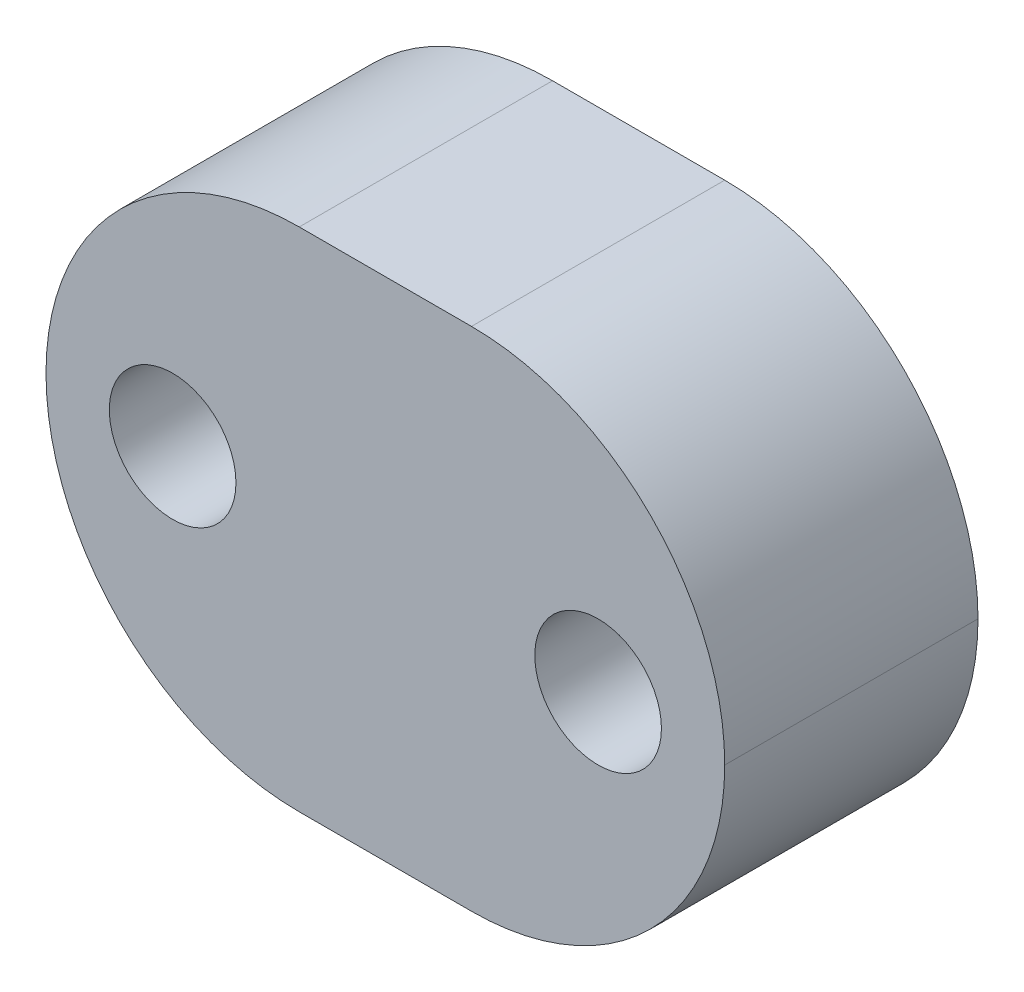
ISO-10303-21;
HEADER;
FILE_DESCRIPTION(('STEP AP214'),'2;1');
FILE_NAME('part.step','',(''),(''),'','','');
FILE_SCHEMA(('AUTOMOTIVE_DESIGN { 1 0 10303 214 1 1 1 1 }'));
ENDSEC;
DATA;
#1=APPLICATION_CONTEXT('core data for automotive mechanical design processes');
#2=APPLICATION_PROTOCOL_DEFINITION('international standard','automotive_design',2000,#1);
#3=PRODUCT_CONTEXT('',#1,'mechanical');
#4=PRODUCT('Part','Part','',(#3));
#5=PRODUCT_RELATED_PRODUCT_CATEGORY('part','',(#4));
#6=PRODUCT_DEFINITION_FORMATION('','',#4);
#7=PRODUCT_DEFINITION_CONTEXT('part definition',#1,'design');
#8=PRODUCT_DEFINITION('design','',#6,#7);
#9=PRODUCT_DEFINITION_SHAPE('','',#8);
#10=(LENGTH_UNIT() NAMED_UNIT(*) SI_UNIT(.MILLI.,.METRE.));
#11=(NAMED_UNIT(*) PLANE_ANGLE_UNIT() SI_UNIT($,.RADIAN.));
#12=(NAMED_UNIT(*) SI_UNIT($,.STERADIAN.) SOLID_ANGLE_UNIT());
#13=UNCERTAINTY_MEASURE_WITH_UNIT(LENGTH_MEASURE(1.E-05),#10,'distance_accuracy_value','');
#14=(GEOMETRIC_REPRESENTATION_CONTEXT(3) GLOBAL_UNCERTAINTY_ASSIGNED_CONTEXT((#13)) GLOBAL_UNIT_ASSIGNED_CONTEXT((#10,
#11,#12)) REPRESENTATION_CONTEXT('',''));
#15=CARTESIAN_POINT('',(0.,0.,0.));
#16=DIRECTION('',(0.,0.,1.));
#17=DIRECTION('',(1.,0.,0.));
#18=AXIS2_PLACEMENT_3D('',#15,#16,#17);
#19=CARTESIAN_POINT('',(0.,0.,10.));
#20=DIRECTION('',(0.,0.,1.));
#21=DIRECTION('',(1.,0.,0.));
#22=AXIS2_PLACEMENT_3D('',#19,#20,#21);
#23=PLANE('',#22);
#24=CARTESIAN_POINT('',(-8.4,0.,10.));
#25=DIRECTION('',(0.,0.,1.));
#26=DIRECTION('',(1.,0.,0.));
#27=AXIS2_PLACEMENT_3D('',#24,#25,#26);
#28=CIRCLE('',#27,2.5);
#29=CARTESIAN_POINT('',(-5.9,0.,10.));
#30=VERTEX_POINT('',#29);
#31=EDGE_CURVE('E136',#30,#30,#28,.T.);
#32=ORIENTED_EDGE('',*,*,#31,.F.);
#33=EDGE_LOOP('',(#32));
#34=FACE_BOUND('',#33,.T.);
#35=DIRECTION('',(1.,0.,0.));
#36=VECTOR('',#35,1.);
#37=CARTESIAN_POINT('',(-13.4,-10.,10.));
#38=LINE('',#37,#36);
#39=CARTESIAN_POINT('',(-3.4,-10.,10.));
#40=VERTEX_POINT('',#39);
#41=CARTESIAN_POINT('',(3.4,-10.,10.));
#42=VERTEX_POINT('',#41);
#43=EDGE_CURVE('E128',#40,#42,#38,.T.);
#44=ORIENTED_EDGE('',*,*,#43,.T.);
#45=CARTESIAN_POINT('',(3.4,0.,10.));
#46=DIRECTION('',(0.,0.,1.));
#47=DIRECTION('',(1.,0.,0.));
#48=AXIS2_PLACEMENT_3D('',#45,#46,#47);
#49=CIRCLE('',#48,10.);
#50=CARTESIAN_POINT('',(13.4,0.,10.));
#51=VERTEX_POINT('',#50);
#52=EDGE_CURVE('E123',#42,#51,#49,.T.);
#53=ORIENTED_EDGE('',*,*,#52,.T.);
#54=CARTESIAN_POINT('',(3.4,0.,10.));
#55=DIRECTION('',(0.,0.,1.));
#56=DIRECTION('',(1.,0.,0.));
#57=AXIS2_PLACEMENT_3D('',#54,#55,#56);
#58=CIRCLE('',#57,10.);
#59=CARTESIAN_POINT('',(3.4,10.,10.));
#60=VERTEX_POINT('',#59);
#61=EDGE_CURVE('E105',#51,#60,#58,.T.);
#62=ORIENTED_EDGE('',*,*,#61,.T.);
#63=DIRECTION('',(-1.,0.,0.));
#64=VECTOR('',#63,1.);
#65=CARTESIAN_POINT('',(-13.4,10.,10.));
#66=LINE('',#65,#64);
#67=CARTESIAN_POINT('',(-3.4,10.,10.));
#68=VERTEX_POINT('',#67);
#69=EDGE_CURVE('E133',#60,#68,#66,.T.);
#70=ORIENTED_EDGE('',*,*,#69,.T.);
#71=CARTESIAN_POINT('',(-3.4,0.,10.));
#72=DIRECTION('',(0.,0.,1.));
#73=DIRECTION('',(1.,0.,0.));
#74=AXIS2_PLACEMENT_3D('',#71,#72,#73);
#75=CIRCLE('',#74,10.);
#76=CARTESIAN_POINT('',(-13.4,0.,10.));
#77=VERTEX_POINT('',#76);
#78=EDGE_CURVE('E50',#68,#77,#75,.T.);
#79=ORIENTED_EDGE('',*,*,#78,.T.);
#80=CARTESIAN_POINT('',(-3.4,0.,10.));
#81=DIRECTION('',(0.,0.,1.));
#82=DIRECTION('',(1.,0.,0.));
#83=AXIS2_PLACEMENT_3D('',#80,#81,#82);
#84=CIRCLE('',#83,10.);
#85=EDGE_CURVE('E120',#77,#40,#84,.T.);
#86=ORIENTED_EDGE('',*,*,#85,.T.);
#87=EDGE_LOOP('',(#44,#53,#62,#70,#79,#86));
#88=FACE_BOUND('',#87,.T.);
#89=CARTESIAN_POINT('',(8.4,0.,10.));
#90=DIRECTION('',(0.,0.,1.));
#91=DIRECTION('',(1.,0.,0.));
#92=AXIS2_PLACEMENT_3D('',#89,#90,#91);
#93=CIRCLE('',#92,2.5);
#94=CARTESIAN_POINT('',(10.9,0.,10.));
#95=VERTEX_POINT('',#94);
#96=EDGE_CURVE('E184',#95,#95,#93,.T.);
#97=ORIENTED_EDGE('',*,*,#96,.F.);
#98=EDGE_LOOP('',(#97));
#99=FACE_BOUND('',#98,.T.);
#100=ADVANCED_FACE('F33',(#34,#88,#99),#23,.T.);
#101=CARTESIAN_POINT('',(0.,0.,0.));
#102=DIRECTION('',(0.,0.,1.));
#103=DIRECTION('',(1.,0.,0.));
#104=AXIS2_PLACEMENT_3D('',#101,#102,#103);
#105=PLANE('',#104);
#106=CARTESIAN_POINT('',(-8.4,0.,0.));
#107=DIRECTION('',(0.,0.,1.));
#108=DIRECTION('',(1.,0.,0.));
#109=AXIS2_PLACEMENT_3D('',#106,#107,#108);
#110=CIRCLE('',#109,2.5);
#111=CARTESIAN_POINT('',(-5.9,0.,0.));
#112=VERTEX_POINT('',#111);
#113=EDGE_CURVE('E188',#112,#112,#110,.T.);
#114=ORIENTED_EDGE('',*,*,#113,.T.);
#115=EDGE_LOOP('',(#114));
#116=FACE_BOUND('',#115,.T.);
#117=CARTESIAN_POINT('',(3.4,0.,0.));
#118=DIRECTION('',(0.,0.,1.));
#119=DIRECTION('',(1.,0.,0.));
#120=AXIS2_PLACEMENT_3D('',#117,#118,#119);
#121=CIRCLE('',#120,10.);
#122=CARTESIAN_POINT('',(3.4,10.,0.));
#123=VERTEX_POINT('',#122);
#124=CARTESIAN_POINT('',(13.4,0.,0.));
#125=VERTEX_POINT('',#124);
#126=EDGE_CURVE('E88',#123,#125,#121,.F.);
#127=ORIENTED_EDGE('',*,*,#126,.T.);
#128=CARTESIAN_POINT('',(3.4,0.,0.));
#129=DIRECTION('',(0.,0.,1.));
#130=DIRECTION('',(1.,0.,0.));
#131=AXIS2_PLACEMENT_3D('',#128,#129,#130);
#132=CIRCLE('',#131,10.);
#133=CARTESIAN_POINT('',(3.4,-10.,0.));
#134=VERTEX_POINT('',#133);
#135=EDGE_CURVE('E94',#125,#134,#132,.F.);
#136=ORIENTED_EDGE('',*,*,#135,.T.);
#137=DIRECTION('',(1.,0.,0.));
#138=VECTOR('',#137,1.);
#139=CARTESIAN_POINT('',(-13.4,-10.,0.));
#140=LINE('',#139,#138);
#141=CARTESIAN_POINT('',(-3.4,-10.,0.));
#142=VERTEX_POINT('',#141);
#143=EDGE_CURVE('E132',#142,#134,#140,.T.);
#144=ORIENTED_EDGE('',*,*,#143,.F.);
#145=CARTESIAN_POINT('',(-3.4,0.,0.));
#146=DIRECTION('',(0.,0.,1.));
#147=DIRECTION('',(1.,0.,0.));
#148=AXIS2_PLACEMENT_3D('',#145,#146,#147);
#149=CIRCLE('',#148,10.);
#150=CARTESIAN_POINT('',(-13.4,0.,0.));
#151=VERTEX_POINT('',#150);
#152=EDGE_CURVE('E99',#142,#151,#149,.F.);
#153=ORIENTED_EDGE('',*,*,#152,.T.);
#154=CARTESIAN_POINT('',(-3.4,0.,0.));
#155=DIRECTION('',(0.,0.,1.));
#156=DIRECTION('',(1.,0.,0.));
#157=AXIS2_PLACEMENT_3D('',#154,#155,#156);
#158=CIRCLE('',#157,10.);
#159=CARTESIAN_POINT('',(-3.4,10.,0.));
#160=VERTEX_POINT('',#159);
#161=EDGE_CURVE('E140',#151,#160,#158,.F.);
#162=ORIENTED_EDGE('',*,*,#161,.T.);
#163=DIRECTION('',(-1.,0.,0.));
#164=VECTOR('',#163,1.);
#165=CARTESIAN_POINT('',(-13.4,10.,0.));
#166=LINE('',#165,#164);
#167=EDGE_CURVE('E96',#123,#160,#166,.T.);
#168=ORIENTED_EDGE('',*,*,#167,.F.);
#169=EDGE_LOOP('',(#127,#136,#144,#153,#162,#168));
#170=FACE_BOUND('',#169,.T.);
#171=CARTESIAN_POINT('',(8.4,0.,0.));
#172=DIRECTION('',(0.,0.,1.));
#173=DIRECTION('',(1.,0.,0.));
#174=AXIS2_PLACEMENT_3D('',#171,#172,#173);
#175=CIRCLE('',#174,2.5);
#176=CARTESIAN_POINT('',(10.9,0.,0.));
#177=VERTEX_POINT('',#176);
#178=EDGE_CURVE('E107',#177,#177,#175,.T.);
#179=ORIENTED_EDGE('',*,*,#178,.T.);
#180=EDGE_LOOP('',(#179));
#181=FACE_BOUND('',#180,.T.);
#182=ADVANCED_FACE('F90',(#116,#170,#181),#105,.F.);
#183=CARTESIAN_POINT('',(-13.4,10.,10.));
#184=DIRECTION('',(0.,-1.,0.));
#185=DIRECTION('',(0.,0.,-1.));
#186=AXIS2_PLACEMENT_3D('',#183,#184,#185);
#187=PLANE('',#186);
#188=ORIENTED_EDGE('',*,*,#69,.F.);
#189=DIRECTION('',(0.,0.,-1.));
#190=VECTOR('',#189,1.);
#191=CARTESIAN_POINT('',(3.4,10.,10.));
#192=LINE('',#191,#190);
#193=EDGE_CURVE('E11',#60,#123,#192,.T.);
#194=ORIENTED_EDGE('',*,*,#193,.T.);
#195=ORIENTED_EDGE('',*,*,#167,.T.);
#196=DIRECTION('',(0.,0.,-1.));
#197=VECTOR('',#196,1.);
#198=CARTESIAN_POINT('',(-3.4,10.,10.));
#199=LINE('',#198,#197);
#200=EDGE_CURVE('E42',#160,#68,#199,.F.);
#201=ORIENTED_EDGE('',*,*,#200,.T.);
#202=EDGE_LOOP('',(#188,#194,#195,#201));
#203=FACE_BOUND('',#202,.T.);
#204=ADVANCED_FACE('F158',(#203),#187,.F.);
#205=CARTESIAN_POINT('',(-13.4,-10.,10.));
#206=DIRECTION('',(0.,1.,0.));
#207=DIRECTION('',(0.,0.,1.));
#208=AXIS2_PLACEMENT_3D('',#205,#206,#207);
#209=PLANE('',#208);
#210=ORIENTED_EDGE('',*,*,#143,.T.);
#211=DIRECTION('',(0.,0.,-1.));
#212=VECTOR('',#211,1.);
#213=CARTESIAN_POINT('',(3.4,-10.,10.));
#214=LINE('',#213,#212);
#215=EDGE_CURVE('E111',#134,#42,#214,.F.);
#216=ORIENTED_EDGE('',*,*,#215,.T.);
#217=ORIENTED_EDGE('',*,*,#43,.F.);
#218=DIRECTION('',(0.,0.,-1.));
#219=VECTOR('',#218,1.);
#220=CARTESIAN_POINT('',(-3.4,-10.,10.));
#221=LINE('',#220,#219);
#222=EDGE_CURVE('E112',#40,#142,#221,.T.);
#223=ORIENTED_EDGE('',*,*,#222,.T.);
#224=EDGE_LOOP('',(#210,#216,#217,#223));
#225=FACE_BOUND('',#224,.T.);
#226=ADVANCED_FACE('F130',(#225),#209,.F.);
#227=CARTESIAN_POINT('',(-8.4,0.,10.));
#228=DIRECTION('',(0.,0.,-1.));
#229=DIRECTION('',(-1.,0.,0.));
#230=AXIS2_PLACEMENT_3D('',#227,#228,#229);
#231=CYLINDRICAL_SURFACE('',#230,2.5);
#232=ORIENTED_EDGE('',*,*,#31,.T.);
#233=EDGE_LOOP('',(#232));
#234=FACE_BOUND('',#233,.T.);
#235=ORIENTED_EDGE('',*,*,#113,.F.);
#236=EDGE_LOOP('',(#235));
#237=FACE_BOUND('',#236,.T.);
#238=ADVANCED_FACE('F163',(#234,#237),#231,.F.);
#239=CARTESIAN_POINT('',(8.4,0.,10.));
#240=DIRECTION('',(0.,0.,-1.));
#241=DIRECTION('',(-1.,0.,0.));
#242=AXIS2_PLACEMENT_3D('',#239,#240,#241);
#243=CYLINDRICAL_SURFACE('',#242,2.5);
#244=ORIENTED_EDGE('',*,*,#96,.T.);
#245=EDGE_LOOP('',(#244));
#246=FACE_BOUND('',#245,.T.);
#247=ORIENTED_EDGE('',*,*,#178,.F.);
#248=EDGE_LOOP('',(#247));
#249=FACE_BOUND('',#248,.T.);
#250=ADVANCED_FACE('F172',(#246,#249),#243,.F.);
#251=CARTESIAN_POINT('',(3.4,0.,10.));
#252=DIRECTION('',(0.,0.,-1.));
#253=DIRECTION('',(-1.,0.,0.));
#254=AXIS2_PLACEMENT_3D('',#251,#252,#253);
#255=CYLINDRICAL_SURFACE('',#254,10.);
#256=ORIENTED_EDGE('',*,*,#193,.F.);
#257=ORIENTED_EDGE('',*,*,#61,.F.);
#258=DIRECTION('',(0.,0.,-1.));
#259=VECTOR('',#258,1.);
#260=CARTESIAN_POINT('',(13.4,0.,10.));
#261=LINE('',#260,#259);
#262=EDGE_CURVE('E103',#125,#51,#261,.F.);
#263=ORIENTED_EDGE('',*,*,#262,.F.);
#264=ORIENTED_EDGE('',*,*,#126,.F.);
#265=EDGE_LOOP('',(#256,#257,#263,#264));
#266=FACE_BOUND('',#265,.T.);
#267=ADVANCED_FACE('F104',(#266),#255,.T.);
#268=CARTESIAN_POINT('',(3.4,0.,10.));
#269=DIRECTION('',(0.,0.,-1.));
#270=DIRECTION('',(-1.,0.,0.));
#271=AXIS2_PLACEMENT_3D('',#268,#269,#270);
#272=CYLINDRICAL_SURFACE('',#271,10.);
#273=ORIENTED_EDGE('',*,*,#52,.F.);
#274=ORIENTED_EDGE('',*,*,#215,.F.);
#275=ORIENTED_EDGE('',*,*,#135,.F.);
#276=ORIENTED_EDGE('',*,*,#262,.T.);
#277=EDGE_LOOP('',(#273,#274,#275,#276));
#278=FACE_BOUND('',#277,.T.);
#279=ADVANCED_FACE('F109',(#278),#272,.T.);
#280=CARTESIAN_POINT('',(-3.4,0.,10.));
#281=DIRECTION('',(0.,0.,-1.));
#282=DIRECTION('',(-1.,0.,0.));
#283=AXIS2_PLACEMENT_3D('',#280,#281,#282);
#284=CYLINDRICAL_SURFACE('',#283,10.);
#285=DIRECTION('',(0.,0.,-1.));
#286=VECTOR('',#285,1.);
#287=CARTESIAN_POINT('',(-13.4,0.,10.));
#288=LINE('',#287,#286);
#289=EDGE_CURVE('E37',#77,#151,#288,.T.);
#290=ORIENTED_EDGE('',*,*,#289,.F.);
#291=ORIENTED_EDGE('',*,*,#78,.F.);
#292=ORIENTED_EDGE('',*,*,#200,.F.);
#293=ORIENTED_EDGE('',*,*,#161,.F.);
#294=EDGE_LOOP('',(#290,#291,#292,#293));
#295=FACE_BOUND('',#294,.T.);
#296=ADVANCED_FACE('F35',(#295),#284,.T.);
#297=CARTESIAN_POINT('',(-3.4,0.,10.));
#298=DIRECTION('',(0.,0.,-1.));
#299=DIRECTION('',(-1.,0.,0.));
#300=AXIS2_PLACEMENT_3D('',#297,#298,#299);
#301=CYLINDRICAL_SURFACE('',#300,10.);
#302=ORIENTED_EDGE('',*,*,#85,.F.);
#303=ORIENTED_EDGE('',*,*,#289,.T.);
#304=ORIENTED_EDGE('',*,*,#152,.F.);
#305=ORIENTED_EDGE('',*,*,#222,.F.);
#306=EDGE_LOOP('',(#302,#303,#304,#305));
#307=FACE_BOUND('',#306,.T.);
#308=ADVANCED_FACE('F146',(#307),#301,.T.);
#309=CLOSED_SHELL('',(#100,#182,#204,#226,#238,#250,#267,#279,#296,#308));
#310=MANIFOLD_SOLID_BREP('B2',#309);
#311=ADVANCED_BREP_SHAPE_REPRESENTATION('',(#18,#310),#14);
#312=SHAPE_DEFINITION_REPRESENTATION(#9,#311);
ENDSEC;
END-ISO-10303-21;
